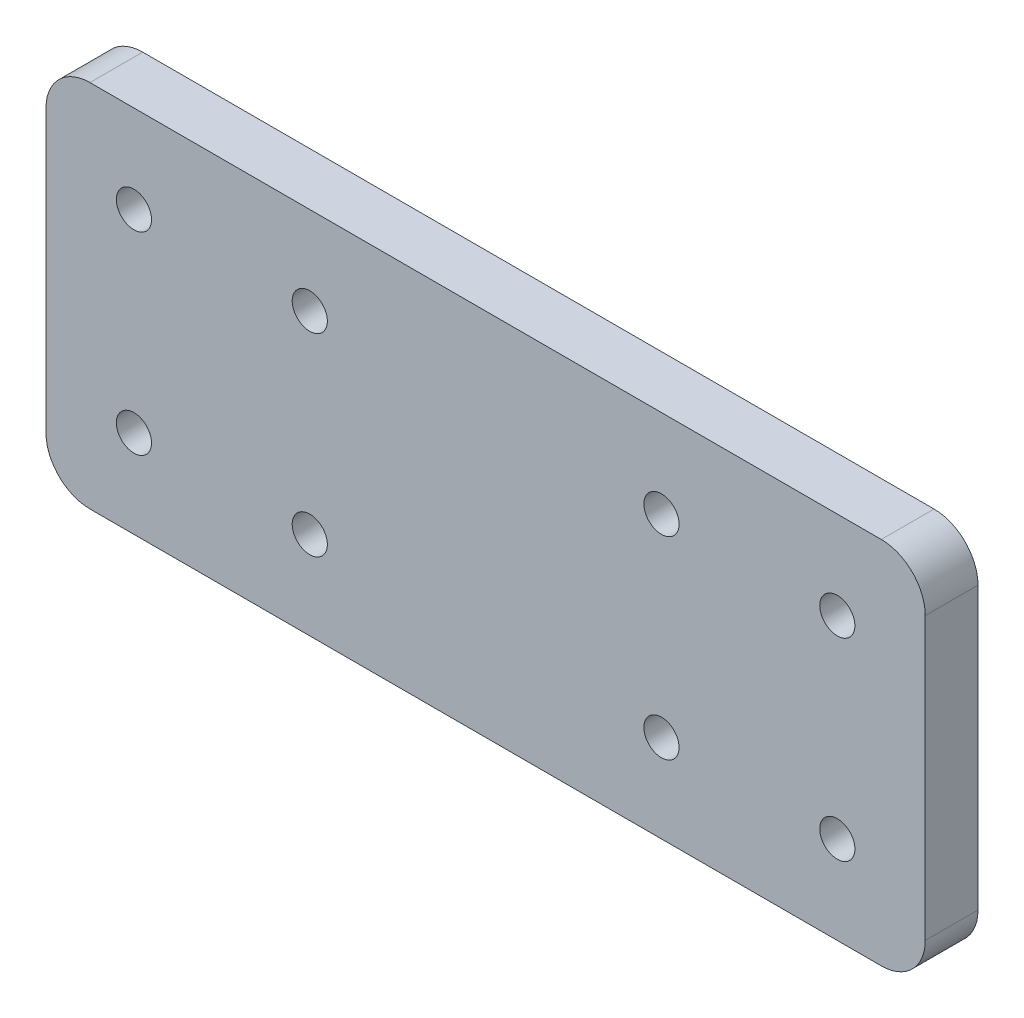
ISO-10303-21;
HEADER;
FILE_DESCRIPTION(('STEP AP214'),'2;1');
FILE_NAME('part.step','',(''),(''),'','','');
FILE_SCHEMA(('AUTOMOTIVE_DESIGN { 1 0 10303 214 1 1 1 1 }'));
ENDSEC;
DATA;
#1=APPLICATION_CONTEXT('core data for automotive mechanical design processes');
#2=APPLICATION_PROTOCOL_DEFINITION('international standard','automotive_design',2000,#1);
#3=PRODUCT_CONTEXT('',#1,'mechanical');
#4=PRODUCT('Part','Part','',(#3));
#5=PRODUCT_RELATED_PRODUCT_CATEGORY('part','',(#4));
#6=PRODUCT_DEFINITION_FORMATION('','',#4);
#7=PRODUCT_DEFINITION_CONTEXT('part definition',#1,'design');
#8=PRODUCT_DEFINITION('design','',#6,#7);
#9=PRODUCT_DEFINITION_SHAPE('','',#8);
#10=(LENGTH_UNIT() NAMED_UNIT(*) SI_UNIT(.MILLI.,.METRE.));
#11=(NAMED_UNIT(*) PLANE_ANGLE_UNIT() SI_UNIT($,.RADIAN.));
#12=(NAMED_UNIT(*) SI_UNIT($,.STERADIAN.) SOLID_ANGLE_UNIT());
#13=UNCERTAINTY_MEASURE_WITH_UNIT(LENGTH_MEASURE(1.E-05),#10,'distance_accuracy_value','');
#14=(GEOMETRIC_REPRESENTATION_CONTEXT(3) GLOBAL_UNCERTAINTY_ASSIGNED_CONTEXT((#13)) GLOBAL_UNIT_ASSIGNED_CONTEXT((#10,
#11,#12)) REPRESENTATION_CONTEXT('',''));
#15=CARTESIAN_POINT('',(0.,0.,0.));
#16=DIRECTION('',(0.,0.,1.));
#17=DIRECTION('',(1.,0.,0.));
#18=AXIS2_PLACEMENT_3D('',#15,#16,#17);
#19=CARTESIAN_POINT('',(45.,-16.,6.));
#20=DIRECTION('',(0.,0.,1.));
#21=DIRECTION('',(1.,0.,0.));
#22=AXIS2_PLACEMENT_3D('',#19,#20,#21);
#23=PLANE('',#22);
#24=CARTESIAN_POINT('',(40.,11.,6.));
#25=DIRECTION('',(0.,0.,1.));
#26=DIRECTION('',(-1.,0.,0.));
#27=AXIS2_PLACEMENT_3D('',#24,#25,#26);
#28=CIRCLE('',#27,2.);
#29=CARTESIAN_POINT('',(38.,11.,6.));
#30=VERTEX_POINT('',#29);
#31=EDGE_CURVE('E253',#30,#30,#28,.T.);
#32=ORIENTED_EDGE('',*,*,#31,.F.);
#33=EDGE_LOOP('',(#32));
#34=FACE_BOUND('',#33,.T.);
#35=CARTESIAN_POINT('',(20.,-11.,6.));
#36=DIRECTION('',(0.,0.,1.));
#37=DIRECTION('',(1.,0.,0.));
#38=AXIS2_PLACEMENT_3D('',#35,#36,#37);
#39=CIRCLE('',#38,2.);
#40=CARTESIAN_POINT('',(22.,-11.,6.));
#41=VERTEX_POINT('',#40);
#42=EDGE_CURVE('E237',#41,#41,#39,.T.);
#43=ORIENTED_EDGE('',*,*,#42,.F.);
#44=EDGE_LOOP('',(#43));
#45=FACE_BOUND('',#44,.T.);
#46=CARTESIAN_POINT('',(-40.,-11.,6.));
#47=DIRECTION('',(0.,0.,1.));
#48=DIRECTION('',(-1.,0.,0.));
#49=AXIS2_PLACEMENT_3D('',#46,#47,#48);
#50=CIRCLE('',#49,2.);
#51=CARTESIAN_POINT('',(-42.,-11.,6.));
#52=VERTEX_POINT('',#51);
#53=EDGE_CURVE('E221',#52,#52,#50,.T.);
#54=ORIENTED_EDGE('',*,*,#53,.F.);
#55=EDGE_LOOP('',(#54));
#56=FACE_BOUND('',#55,.T.);
#57=CARTESIAN_POINT('',(-40.,11.,6.));
#58=DIRECTION('',(0.,0.,1.));
#59=DIRECTION('',(1.,0.,0.));
#60=AXIS2_PLACEMENT_3D('',#57,#58,#59);
#61=CIRCLE('',#60,2.);
#62=CARTESIAN_POINT('',(-38.,11.,6.));
#63=VERTEX_POINT('',#62);
#64=EDGE_CURVE('E146',#63,#63,#61,.T.);
#65=ORIENTED_EDGE('',*,*,#64,.F.);
#66=EDGE_LOOP('',(#65));
#67=FACE_BOUND('',#66,.T.);
#68=CARTESIAN_POINT('',(45.,-16.,6.));
#69=DIRECTION('',(0.,0.,1.));
#70=DIRECTION('',(1.,0.,0.));
#71=AXIS2_PLACEMENT_3D('',#68,#69,#70);
#72=CIRCLE('',#71,5.);
#73=CARTESIAN_POINT('',(45.,-21.,6.));
#74=VERTEX_POINT('',#73);
#75=CARTESIAN_POINT('',(50.,-16.,6.));
#76=VERTEX_POINT('',#75);
#77=EDGE_CURVE('E164',#74,#76,#72,.T.);
#78=ORIENTED_EDGE('',*,*,#77,.T.);
#79=DIRECTION('',(0.,1.,0.));
#80=VECTOR('',#79,1.);
#81=CARTESIAN_POINT('',(50.,-16.,6.));
#82=LINE('',#81,#80);
#83=CARTESIAN_POINT('',(50.,16.,6.));
#84=VERTEX_POINT('',#83);
#85=EDGE_CURVE('E100',#76,#84,#82,.T.);
#86=ORIENTED_EDGE('',*,*,#85,.T.);
#87=CARTESIAN_POINT('',(45.,16.,6.));
#88=DIRECTION('',(0.,0.,1.));
#89=DIRECTION('',(1.,0.,0.));
#90=AXIS2_PLACEMENT_3D('',#87,#88,#89);
#91=CIRCLE('',#90,5.);
#92=CARTESIAN_POINT('',(45.,21.,6.));
#93=VERTEX_POINT('',#92);
#94=EDGE_CURVE('E185',#84,#93,#91,.T.);
#95=ORIENTED_EDGE('',*,*,#94,.T.);
#96=DIRECTION('',(-1.,0.,0.));
#97=VECTOR('',#96,1.);
#98=CARTESIAN_POINT('',(45.,21.,6.));
#99=LINE('',#98,#97);
#100=CARTESIAN_POINT('',(-45.,21.,6.));
#101=VERTEX_POINT('',#100);
#102=EDGE_CURVE('E199',#93,#101,#99,.T.);
#103=ORIENTED_EDGE('',*,*,#102,.T.);
#104=CARTESIAN_POINT('',(-45.,16.,6.));
#105=DIRECTION('',(0.,0.,1.));
#106=DIRECTION('',(1.,0.,0.));
#107=AXIS2_PLACEMENT_3D('',#104,#105,#106);
#108=CIRCLE('',#107,5.);
#109=CARTESIAN_POINT('',(-50.,16.,6.));
#110=VERTEX_POINT('',#109);
#111=EDGE_CURVE('E119',#101,#110,#108,.T.);
#112=ORIENTED_EDGE('',*,*,#111,.T.);
#113=DIRECTION('',(0.,-1.,0.));
#114=VECTOR('',#113,1.);
#115=CARTESIAN_POINT('',(-50.,-16.,6.));
#116=LINE('',#115,#114);
#117=CARTESIAN_POINT('',(-50.,-16.,6.));
#118=VERTEX_POINT('',#117);
#119=EDGE_CURVE('E113',#110,#118,#116,.T.);
#120=ORIENTED_EDGE('',*,*,#119,.T.);
#121=CARTESIAN_POINT('',(-45.,-16.,6.));
#122=DIRECTION('',(0.,0.,1.));
#123=DIRECTION('',(-1.,0.,0.));
#124=AXIS2_PLACEMENT_3D('',#121,#122,#123);
#125=CIRCLE('',#124,5.);
#126=CARTESIAN_POINT('',(-45.,-21.,6.));
#127=VERTEX_POINT('',#126);
#128=EDGE_CURVE('E117',#118,#127,#125,.T.);
#129=ORIENTED_EDGE('',*,*,#128,.T.);
#130=DIRECTION('',(1.,0.,0.));
#131=VECTOR('',#130,1.);
#132=CARTESIAN_POINT('',(45.,-21.,6.));
#133=LINE('',#132,#131);
#134=EDGE_CURVE('E57',#127,#74,#133,.T.);
#135=ORIENTED_EDGE('',*,*,#134,.T.);
#136=EDGE_LOOP('',(#78,#86,#95,#103,#112,#120,#129,#135));
#137=FACE_BOUND('',#136,.T.);
#138=CARTESIAN_POINT('',(-20.,11.,6.));
#139=DIRECTION('',(0.,0.,1.));
#140=DIRECTION('',(1.,0.,0.));
#141=AXIS2_PLACEMENT_3D('',#138,#139,#140);
#142=CIRCLE('',#141,2.);
#143=CARTESIAN_POINT('',(-18.,11.,6.));
#144=VERTEX_POINT('',#143);
#145=EDGE_CURVE('E213',#144,#144,#142,.T.);
#146=ORIENTED_EDGE('',*,*,#145,.F.);
#147=EDGE_LOOP('',(#146));
#148=FACE_BOUND('',#147,.T.);
#149=CARTESIAN_POINT('',(-20.,-11.,6.));
#150=DIRECTION('',(0.,0.,1.));
#151=DIRECTION('',(-1.,0.,0.));
#152=AXIS2_PLACEMENT_3D('',#149,#150,#151);
#153=CIRCLE('',#152,2.);
#154=CARTESIAN_POINT('',(-22.,-11.,6.));
#155=VERTEX_POINT('',#154);
#156=EDGE_CURVE('E229',#155,#155,#153,.T.);
#157=ORIENTED_EDGE('',*,*,#156,.F.);
#158=EDGE_LOOP('',(#157));
#159=FACE_BOUND('',#158,.T.);
#160=CARTESIAN_POINT('',(40.,-11.,6.));
#161=DIRECTION('',(0.,0.,1.));
#162=DIRECTION('',(1.,0.,0.));
#163=AXIS2_PLACEMENT_3D('',#160,#161,#162);
#164=CIRCLE('',#163,2.);
#165=CARTESIAN_POINT('',(42.,-11.,6.));
#166=VERTEX_POINT('',#165);
#167=EDGE_CURVE('E245',#166,#166,#164,.T.);
#168=ORIENTED_EDGE('',*,*,#167,.F.);
#169=EDGE_LOOP('',(#168));
#170=FACE_BOUND('',#169,.T.);
#171=CARTESIAN_POINT('',(20.,11.,6.));
#172=DIRECTION('',(0.,0.,1.));
#173=DIRECTION('',(-1.,0.,0.));
#174=AXIS2_PLACEMENT_3D('',#171,#172,#173);
#175=CIRCLE('',#174,2.);
#176=CARTESIAN_POINT('',(18.,11.,6.));
#177=VERTEX_POINT('',#176);
#178=EDGE_CURVE('E261',#177,#177,#175,.T.);
#179=ORIENTED_EDGE('',*,*,#178,.F.);
#180=EDGE_LOOP('',(#179));
#181=FACE_BOUND('',#180,.T.);
#182=ADVANCED_FACE('F39',(#34,#45,#56,#67,#137,#148,#159,#170,#181),#23,.T.);
#183=CARTESIAN_POINT('',(45.,-16.,0.));
#184=DIRECTION('',(0.,0.,1.));
#185=DIRECTION('',(1.,0.,0.));
#186=AXIS2_PLACEMENT_3D('',#183,#184,#185);
#187=PLANE('',#186);
#188=CARTESIAN_POINT('',(45.,-16.,0.));
#189=DIRECTION('',(0.,0.,1.));
#190=DIRECTION('',(1.,0.,0.));
#191=AXIS2_PLACEMENT_3D('',#188,#189,#190);
#192=CIRCLE('',#191,5.);
#193=CARTESIAN_POINT('',(45.,-21.,0.));
#194=VERTEX_POINT('',#193);
#195=CARTESIAN_POINT('',(50.,-16.,0.));
#196=VERTEX_POINT('',#195);
#197=EDGE_CURVE('E141',#194,#196,#192,.T.);
#198=ORIENTED_EDGE('',*,*,#197,.F.);
#199=DIRECTION('',(1.,0.,0.));
#200=VECTOR('',#199,1.);
#201=CARTESIAN_POINT('',(45.,-21.,0.));
#202=LINE('',#201,#200);
#203=CARTESIAN_POINT('',(-45.,-21.,0.));
#204=VERTEX_POINT('',#203);
#205=EDGE_CURVE('E92',#204,#194,#202,.T.);
#206=ORIENTED_EDGE('',*,*,#205,.F.);
#207=CARTESIAN_POINT('',(-45.,-16.,0.));
#208=DIRECTION('',(0.,0.,1.));
#209=DIRECTION('',(-1.,0.,0.));
#210=AXIS2_PLACEMENT_3D('',#207,#208,#209);
#211=CIRCLE('',#210,5.);
#212=CARTESIAN_POINT('',(-50.,-16.,0.));
#213=VERTEX_POINT('',#212);
#214=EDGE_CURVE('E86',#213,#204,#211,.T.);
#215=ORIENTED_EDGE('',*,*,#214,.F.);
#216=DIRECTION('',(0.,-1.,0.));
#217=VECTOR('',#216,1.);
#218=CARTESIAN_POINT('',(-50.,-16.,0.));
#219=LINE('',#218,#217);
#220=CARTESIAN_POINT('',(-50.,16.,0.));
#221=VERTEX_POINT('',#220);
#222=EDGE_CURVE('E128',#221,#213,#219,.T.);
#223=ORIENTED_EDGE('',*,*,#222,.F.);
#224=CARTESIAN_POINT('',(-45.,16.,0.));
#225=DIRECTION('',(0.,0.,1.));
#226=DIRECTION('',(1.,0.,0.));
#227=AXIS2_PLACEMENT_3D('',#224,#225,#226);
#228=CIRCLE('',#227,5.);
#229=CARTESIAN_POINT('',(-45.,21.,0.));
#230=VERTEX_POINT('',#229);
#231=EDGE_CURVE('E155',#230,#221,#228,.T.);
#232=ORIENTED_EDGE('',*,*,#231,.F.);
#233=DIRECTION('',(-1.,0.,0.));
#234=VECTOR('',#233,1.);
#235=CARTESIAN_POINT('',(45.,21.,0.));
#236=LINE('',#235,#234);
#237=CARTESIAN_POINT('',(45.,21.,0.));
#238=VERTEX_POINT('',#237);
#239=EDGE_CURVE('E152',#238,#230,#236,.T.);
#240=ORIENTED_EDGE('',*,*,#239,.F.);
#241=CARTESIAN_POINT('',(45.,16.,0.));
#242=DIRECTION('',(0.,0.,1.));
#243=DIRECTION('',(1.,0.,0.));
#244=AXIS2_PLACEMENT_3D('',#241,#242,#243);
#245=CIRCLE('',#244,5.);
#246=CARTESIAN_POINT('',(50.,16.,0.));
#247=VERTEX_POINT('',#246);
#248=EDGE_CURVE('E149',#247,#238,#245,.T.);
#249=ORIENTED_EDGE('',*,*,#248,.F.);
#250=DIRECTION('',(0.,1.,0.));
#251=VECTOR('',#250,1.);
#252=CARTESIAN_POINT('',(50.,-16.,0.));
#253=LINE('',#252,#251);
#254=EDGE_CURVE('E145',#196,#247,#253,.T.);
#255=ORIENTED_EDGE('',*,*,#254,.F.);
#256=EDGE_LOOP('',(#198,#206,#215,#223,#232,#240,#249,#255));
#257=FACE_BOUND('',#256,.T.);
#258=CARTESIAN_POINT('',(-40.,11.,0.));
#259=DIRECTION('',(0.,0.,1.));
#260=DIRECTION('',(1.,0.,0.));
#261=AXIS2_PLACEMENT_3D('',#258,#259,#260);
#262=CIRCLE('',#261,2.);
#263=CARTESIAN_POINT('',(-38.,11.,0.));
#264=VERTEX_POINT('',#263);
#265=EDGE_CURVE('E209',#264,#264,#262,.T.);
#266=ORIENTED_EDGE('',*,*,#265,.T.);
#267=EDGE_LOOP('',(#266));
#268=FACE_BOUND('',#267,.T.);
#269=CARTESIAN_POINT('',(-20.,11.,0.));
#270=DIRECTION('',(0.,0.,1.));
#271=DIRECTION('',(1.,0.,0.));
#272=AXIS2_PLACEMENT_3D('',#269,#270,#271);
#273=CIRCLE('',#272,2.);
#274=CARTESIAN_POINT('',(-18.,11.,0.));
#275=VERTEX_POINT('',#274);
#276=EDGE_CURVE('E217',#275,#275,#273,.T.);
#277=ORIENTED_EDGE('',*,*,#276,.T.);
#278=EDGE_LOOP('',(#277));
#279=FACE_BOUND('',#278,.T.);
#280=CARTESIAN_POINT('',(-40.,-11.,0.));
#281=DIRECTION('',(0.,0.,1.));
#282=DIRECTION('',(-1.,0.,0.));
#283=AXIS2_PLACEMENT_3D('',#280,#281,#282);
#284=CIRCLE('',#283,2.);
#285=CARTESIAN_POINT('',(-42.,-11.,0.));
#286=VERTEX_POINT('',#285);
#287=EDGE_CURVE('E225',#286,#286,#284,.T.);
#288=ORIENTED_EDGE('',*,*,#287,.T.);
#289=EDGE_LOOP('',(#288));
#290=FACE_BOUND('',#289,.T.);
#291=CARTESIAN_POINT('',(-20.,-11.,0.));
#292=DIRECTION('',(0.,0.,1.));
#293=DIRECTION('',(-1.,0.,0.));
#294=AXIS2_PLACEMENT_3D('',#291,#292,#293);
#295=CIRCLE('',#294,2.);
#296=CARTESIAN_POINT('',(-22.,-11.,0.));
#297=VERTEX_POINT('',#296);
#298=EDGE_CURVE('E233',#297,#297,#295,.T.);
#299=ORIENTED_EDGE('',*,*,#298,.T.);
#300=EDGE_LOOP('',(#299));
#301=FACE_BOUND('',#300,.T.);
#302=CARTESIAN_POINT('',(20.,-11.,0.));
#303=DIRECTION('',(0.,0.,1.));
#304=DIRECTION('',(1.,0.,0.));
#305=AXIS2_PLACEMENT_3D('',#302,#303,#304);
#306=CIRCLE('',#305,2.);
#307=CARTESIAN_POINT('',(22.,-11.,0.));
#308=VERTEX_POINT('',#307);
#309=EDGE_CURVE('E241',#308,#308,#306,.T.);
#310=ORIENTED_EDGE('',*,*,#309,.T.);
#311=EDGE_LOOP('',(#310));
#312=FACE_BOUND('',#311,.T.);
#313=CARTESIAN_POINT('',(40.,-11.,0.));
#314=DIRECTION('',(0.,0.,1.));
#315=DIRECTION('',(1.,0.,0.));
#316=AXIS2_PLACEMENT_3D('',#313,#314,#315);
#317=CIRCLE('',#316,2.);
#318=CARTESIAN_POINT('',(42.,-11.,0.));
#319=VERTEX_POINT('',#318);
#320=EDGE_CURVE('E249',#319,#319,#317,.T.);
#321=ORIENTED_EDGE('',*,*,#320,.T.);
#322=EDGE_LOOP('',(#321));
#323=FACE_BOUND('',#322,.T.);
#324=CARTESIAN_POINT('',(40.,11.,0.));
#325=DIRECTION('',(0.,0.,1.));
#326=DIRECTION('',(-1.,0.,0.));
#327=AXIS2_PLACEMENT_3D('',#324,#325,#326);
#328=CIRCLE('',#327,2.);
#329=CARTESIAN_POINT('',(38.,11.,0.));
#330=VERTEX_POINT('',#329);
#331=EDGE_CURVE('E257',#330,#330,#328,.T.);
#332=ORIENTED_EDGE('',*,*,#331,.T.);
#333=EDGE_LOOP('',(#332));
#334=FACE_BOUND('',#333,.T.);
#335=CARTESIAN_POINT('',(20.,11.,0.));
#336=DIRECTION('',(0.,0.,1.));
#337=DIRECTION('',(-1.,0.,0.));
#338=AXIS2_PLACEMENT_3D('',#335,#336,#337);
#339=CIRCLE('',#338,2.);
#340=CARTESIAN_POINT('',(18.,11.,0.));
#341=VERTEX_POINT('',#340);
#342=EDGE_CURVE('E265',#341,#341,#339,.T.);
#343=ORIENTED_EDGE('',*,*,#342,.T.);
#344=EDGE_LOOP('',(#343));
#345=FACE_BOUND('',#344,.T.);
#346=ADVANCED_FACE('F189',(#257,#268,#279,#290,#301,#312,#323,#334,#345),#187,.F.);
#347=CARTESIAN_POINT('',(45.,-16.,6.));
#348=DIRECTION('',(0.,0.,-1.));
#349=DIRECTION('',(-1.,0.,0.));
#350=AXIS2_PLACEMENT_3D('',#347,#348,#349);
#351=CYLINDRICAL_SURFACE('',#350,5.);
#352=ORIENTED_EDGE('',*,*,#197,.T.);
#353=DIRECTION('',(0.,0.,-1.));
#354=VECTOR('',#353,1.);
#355=CARTESIAN_POINT('',(50.,-16.,6.));
#356=LINE('',#355,#354);
#357=EDGE_CURVE('E11',#76,#196,#356,.T.);
#358=ORIENTED_EDGE('',*,*,#357,.F.);
#359=ORIENTED_EDGE('',*,*,#77,.F.);
#360=DIRECTION('',(0.,0.,-1.));
#361=VECTOR('',#360,1.);
#362=CARTESIAN_POINT('',(45.,-21.,6.));
#363=LINE('',#362,#361);
#364=EDGE_CURVE('E137',#74,#194,#363,.T.);
#365=ORIENTED_EDGE('',*,*,#364,.T.);
#366=EDGE_LOOP('',(#352,#358,#359,#365));
#367=FACE_BOUND('',#366,.T.);
#368=ADVANCED_FACE('F41',(#367),#351,.T.);
#369=CARTESIAN_POINT('',(50.,-16.,6.));
#370=DIRECTION('',(-1.,0.,0.));
#371=DIRECTION('',(0.,0.,1.));
#372=AXIS2_PLACEMENT_3D('',#369,#370,#371);
#373=PLANE('',#372);
#374=ORIENTED_EDGE('',*,*,#254,.T.);
#375=DIRECTION('',(0.,0.,-1.));
#376=VECTOR('',#375,1.);
#377=CARTESIAN_POINT('',(50.,16.,6.));
#378=LINE('',#377,#376);
#379=EDGE_CURVE('E49',#84,#247,#378,.T.);
#380=ORIENTED_EDGE('',*,*,#379,.F.);
#381=ORIENTED_EDGE('',*,*,#85,.F.);
#382=ORIENTED_EDGE('',*,*,#357,.T.);
#383=EDGE_LOOP('',(#374,#380,#381,#382));
#384=FACE_BOUND('',#383,.T.);
#385=ADVANCED_FACE('F301',(#384),#373,.F.);
#386=CARTESIAN_POINT('',(45.,16.,6.));
#387=DIRECTION('',(0.,0.,-1.));
#388=DIRECTION('',(-1.,0.,0.));
#389=AXIS2_PLACEMENT_3D('',#386,#387,#388);
#390=CYLINDRICAL_SURFACE('',#389,5.);
#391=ORIENTED_EDGE('',*,*,#248,.T.);
#392=DIRECTION('',(0.,0.,-1.));
#393=VECTOR('',#392,1.);
#394=CARTESIAN_POINT('',(45.,21.,6.));
#395=LINE('',#394,#393);
#396=EDGE_CURVE('E175',#93,#238,#395,.T.);
#397=ORIENTED_EDGE('',*,*,#396,.F.);
#398=ORIENTED_EDGE('',*,*,#94,.F.);
#399=ORIENTED_EDGE('',*,*,#379,.T.);
#400=EDGE_LOOP('',(#391,#397,#398,#399));
#401=FACE_BOUND('',#400,.T.);
#402=ADVANCED_FACE('F183',(#401),#390,.T.);
#403=CARTESIAN_POINT('',(45.,21.,6.));
#404=DIRECTION('',(0.,-1.,0.));
#405=DIRECTION('',(1.,0.,0.));
#406=AXIS2_PLACEMENT_3D('',#403,#404,#405);
#407=PLANE('',#406);
#408=ORIENTED_EDGE('',*,*,#239,.T.);
#409=DIRECTION('',(0.,0.,-1.));
#410=VECTOR('',#409,1.);
#411=CARTESIAN_POINT('',(-45.,21.,6.));
#412=LINE('',#411,#410);
#413=EDGE_CURVE('E171',#101,#230,#412,.T.);
#414=ORIENTED_EDGE('',*,*,#413,.F.);
#415=ORIENTED_EDGE('',*,*,#102,.F.);
#416=ORIENTED_EDGE('',*,*,#396,.T.);
#417=EDGE_LOOP('',(#408,#414,#415,#416));
#418=FACE_BOUND('',#417,.T.);
#419=ADVANCED_FACE('F194',(#418),#407,.F.);
#420=CARTESIAN_POINT('',(-45.,16.,6.));
#421=DIRECTION('',(0.,0.,-1.));
#422=DIRECTION('',(-1.,0.,0.));
#423=AXIS2_PLACEMENT_3D('',#420,#421,#422);
#424=CYLINDRICAL_SURFACE('',#423,5.);
#425=ORIENTED_EDGE('',*,*,#231,.T.);
#426=DIRECTION('',(0.,0.,-1.));
#427=VECTOR('',#426,1.);
#428=CARTESIAN_POINT('',(-50.,16.,6.));
#429=LINE('',#428,#427);
#430=EDGE_CURVE('E130',#110,#221,#429,.T.);
#431=ORIENTED_EDGE('',*,*,#430,.F.);
#432=ORIENTED_EDGE('',*,*,#111,.F.);
#433=ORIENTED_EDGE('',*,*,#413,.T.);
#434=EDGE_LOOP('',(#425,#431,#432,#433));
#435=FACE_BOUND('',#434,.T.);
#436=ADVANCED_FACE('F197',(#435),#424,.T.);
#437=CARTESIAN_POINT('',(-50.,-16.,6.));
#438=DIRECTION('',(1.,0.,0.));
#439=DIRECTION('',(0.,0.,-1.));
#440=AXIS2_PLACEMENT_3D('',#437,#438,#439);
#441=PLANE('',#440);
#442=ORIENTED_EDGE('',*,*,#222,.T.);
#443=DIRECTION('',(0.,0.,-1.));
#444=VECTOR('',#443,1.);
#445=CARTESIAN_POINT('',(-50.,-16.,6.));
#446=LINE('',#445,#444);
#447=EDGE_CURVE('E125',#118,#213,#446,.T.);
#448=ORIENTED_EDGE('',*,*,#447,.F.);
#449=ORIENTED_EDGE('',*,*,#119,.F.);
#450=ORIENTED_EDGE('',*,*,#430,.T.);
#451=EDGE_LOOP('',(#442,#448,#449,#450));
#452=FACE_BOUND('',#451,.T.);
#453=ADVANCED_FACE('F126',(#452),#441,.F.);
#454=CARTESIAN_POINT('',(-45.,-16.,6.));
#455=DIRECTION('',(0.,0.,-1.));
#456=DIRECTION('',(-1.,0.,0.));
#457=AXIS2_PLACEMENT_3D('',#454,#455,#456);
#458=CYLINDRICAL_SURFACE('',#457,5.);
#459=ORIENTED_EDGE('',*,*,#214,.T.);
#460=DIRECTION('',(0.,0.,-1.));
#461=VECTOR('',#460,1.);
#462=CARTESIAN_POINT('',(-45.,-21.,6.));
#463=LINE('',#462,#461);
#464=EDGE_CURVE('E131',#127,#204,#463,.T.);
#465=ORIENTED_EDGE('',*,*,#464,.F.);
#466=ORIENTED_EDGE('',*,*,#128,.F.);
#467=ORIENTED_EDGE('',*,*,#447,.T.);
#468=EDGE_LOOP('',(#459,#465,#466,#467));
#469=FACE_BOUND('',#468,.T.);
#470=ADVANCED_FACE('F133',(#469),#458,.T.);
#471=CARTESIAN_POINT('',(45.,-21.,6.));
#472=DIRECTION('',(0.,1.,0.));
#473=DIRECTION('',(-1.,0.,0.));
#474=AXIS2_PLACEMENT_3D('',#471,#472,#473);
#475=PLANE('',#474);
#476=ORIENTED_EDGE('',*,*,#205,.T.);
#477=ORIENTED_EDGE('',*,*,#364,.F.);
#478=ORIENTED_EDGE('',*,*,#134,.F.);
#479=ORIENTED_EDGE('',*,*,#464,.T.);
#480=EDGE_LOOP('',(#476,#477,#478,#479));
#481=FACE_BOUND('',#480,.T.);
#482=ADVANCED_FACE('F289',(#481),#475,.F.);
#483=CARTESIAN_POINT('',(-40.,11.,6.));
#484=DIRECTION('',(0.,0.,-1.));
#485=DIRECTION('',(-1.,0.,0.));
#486=AXIS2_PLACEMENT_3D('',#483,#484,#485);
#487=CYLINDRICAL_SURFACE('',#486,2.);
#488=ORIENTED_EDGE('',*,*,#64,.T.);
#489=EDGE_LOOP('',(#488));
#490=FACE_BOUND('',#489,.T.);
#491=ORIENTED_EDGE('',*,*,#265,.F.);
#492=EDGE_LOOP('',(#491));
#493=FACE_BOUND('',#492,.T.);
#494=ADVANCED_FACE('F286',(#490,#493),#487,.F.);
#495=CARTESIAN_POINT('',(-20.,11.,6.));
#496=DIRECTION('',(0.,0.,-1.));
#497=DIRECTION('',(-1.,0.,0.));
#498=AXIS2_PLACEMENT_3D('',#495,#496,#497);
#499=CYLINDRICAL_SURFACE('',#498,2.);
#500=ORIENTED_EDGE('',*,*,#145,.T.);
#501=EDGE_LOOP('',(#500));
#502=FACE_BOUND('',#501,.T.);
#503=ORIENTED_EDGE('',*,*,#276,.F.);
#504=EDGE_LOOP('',(#503));
#505=FACE_BOUND('',#504,.T.);
#506=ADVANCED_FACE('F365',(#502,#505),#499,.F.);
#507=CARTESIAN_POINT('',(-40.,-11.,6.));
#508=DIRECTION('',(0.,0.,-1.));
#509=DIRECTION('',(-1.,0.,0.));
#510=AXIS2_PLACEMENT_3D('',#507,#508,#509);
#511=CYLINDRICAL_SURFACE('',#510,2.);
#512=ORIENTED_EDGE('',*,*,#53,.T.);
#513=EDGE_LOOP('',(#512));
#514=FACE_BOUND('',#513,.T.);
#515=ORIENTED_EDGE('',*,*,#287,.F.);
#516=EDGE_LOOP('',(#515));
#517=FACE_BOUND('',#516,.T.);
#518=ADVANCED_FACE('F373',(#514,#517),#511,.F.);
#519=CARTESIAN_POINT('',(-20.,-11.,6.));
#520=DIRECTION('',(0.,0.,-1.));
#521=DIRECTION('',(-1.,0.,0.));
#522=AXIS2_PLACEMENT_3D('',#519,#520,#521);
#523=CYLINDRICAL_SURFACE('',#522,2.);
#524=ORIENTED_EDGE('',*,*,#156,.T.);
#525=EDGE_LOOP('',(#524));
#526=FACE_BOUND('',#525,.T.);
#527=ORIENTED_EDGE('',*,*,#298,.F.);
#528=EDGE_LOOP('',(#527));
#529=FACE_BOUND('',#528,.T.);
#530=ADVANCED_FACE('F381',(#526,#529),#523,.F.);
#531=CARTESIAN_POINT('',(20.,-11.,6.));
#532=DIRECTION('',(0.,0.,-1.));
#533=DIRECTION('',(-1.,0.,0.));
#534=AXIS2_PLACEMENT_3D('',#531,#532,#533);
#535=CYLINDRICAL_SURFACE('',#534,2.);
#536=ORIENTED_EDGE('',*,*,#42,.T.);
#537=EDGE_LOOP('',(#536));
#538=FACE_BOUND('',#537,.T.);
#539=ORIENTED_EDGE('',*,*,#309,.F.);
#540=EDGE_LOOP('',(#539));
#541=FACE_BOUND('',#540,.T.);
#542=ADVANCED_FACE('F390',(#538,#541),#535,.F.);
#543=CARTESIAN_POINT('',(40.,-11.,6.));
#544=DIRECTION('',(0.,0.,-1.));
#545=DIRECTION('',(-1.,0.,0.));
#546=AXIS2_PLACEMENT_3D('',#543,#544,#545);
#547=CYLINDRICAL_SURFACE('',#546,2.);
#548=ORIENTED_EDGE('',*,*,#167,.T.);
#549=EDGE_LOOP('',(#548));
#550=FACE_BOUND('',#549,.T.);
#551=ORIENTED_EDGE('',*,*,#320,.F.);
#552=EDGE_LOOP('',(#551));
#553=FACE_BOUND('',#552,.T.);
#554=ADVANCED_FACE('F399',(#550,#553),#547,.F.);
#555=CARTESIAN_POINT('',(40.,11.,6.));
#556=DIRECTION('',(0.,0.,-1.));
#557=DIRECTION('',(-1.,0.,0.));
#558=AXIS2_PLACEMENT_3D('',#555,#556,#557);
#559=CYLINDRICAL_SURFACE('',#558,2.);
#560=ORIENTED_EDGE('',*,*,#31,.T.);
#561=EDGE_LOOP('',(#560));
#562=FACE_BOUND('',#561,.T.);
#563=ORIENTED_EDGE('',*,*,#331,.F.);
#564=EDGE_LOOP('',(#563));
#565=FACE_BOUND('',#564,.T.);
#566=ADVANCED_FACE('F408',(#562,#565),#559,.F.);
#567=CARTESIAN_POINT('',(20.,11.,6.));
#568=DIRECTION('',(0.,0.,-1.));
#569=DIRECTION('',(-1.,0.,0.));
#570=AXIS2_PLACEMENT_3D('',#567,#568,#569);
#571=CYLINDRICAL_SURFACE('',#570,2.);
#572=ORIENTED_EDGE('',*,*,#178,.T.);
#573=EDGE_LOOP('',(#572));
#574=FACE_BOUND('',#573,.T.);
#575=ORIENTED_EDGE('',*,*,#342,.F.);
#576=EDGE_LOOP('',(#575));
#577=FACE_BOUND('',#576,.T.);
#578=ADVANCED_FACE('F273',(#574,#577),#571,.F.);
#579=CLOSED_SHELL('',(#182,#346,#368,#385,#402,#419,#436,#453,#470,#482,#494,#506,#518,#530,
#542,#554,#566,#578));
#580=MANIFOLD_SOLID_BREP('B2',#579);
#581=ADVANCED_BREP_SHAPE_REPRESENTATION('',(#18,#580),#14);
#582=SHAPE_DEFINITION_REPRESENTATION(#9,#581);
ENDSEC;
END-ISO-10303-21;
